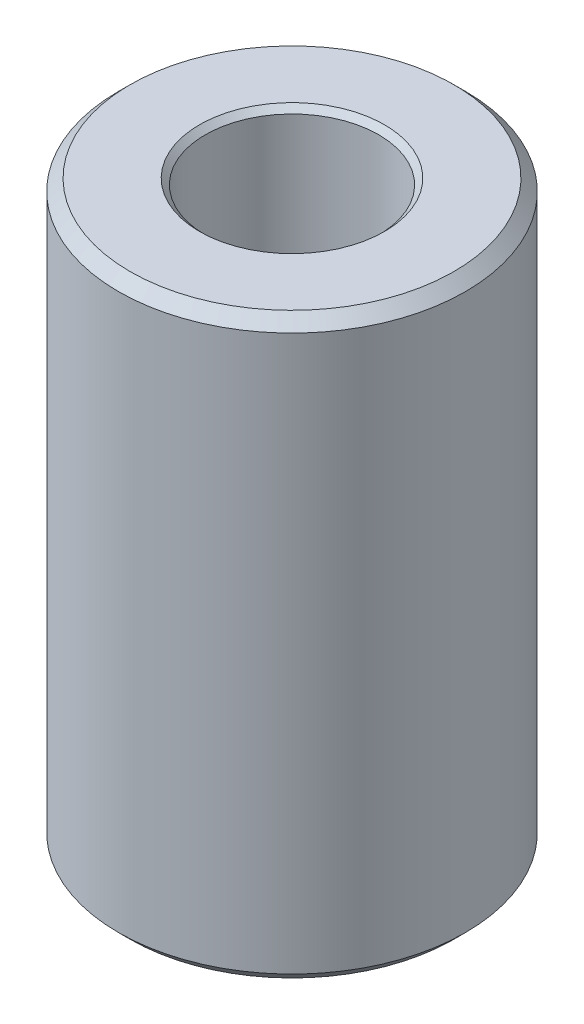
ISO-10303-21;
HEADER;
FILE_DESCRIPTION(('STEP AP214'),'2;1');
FILE_NAME('part.step','',(''),(''),'','','');
FILE_SCHEMA(('AUTOMOTIVE_DESIGN { 1 0 10303 214 1 1 1 1 }'));
ENDSEC;
DATA;
#1=APPLICATION_CONTEXT('core data for automotive mechanical design processes');
#2=APPLICATION_PROTOCOL_DEFINITION('international standard','automotive_design',2000,#1);
#3=PRODUCT_CONTEXT('',#1,'mechanical');
#4=PRODUCT('Part','Part','',(#3));
#5=PRODUCT_RELATED_PRODUCT_CATEGORY('part','',(#4));
#6=PRODUCT_DEFINITION_FORMATION('','',#4);
#7=PRODUCT_DEFINITION_CONTEXT('part definition',#1,'design');
#8=PRODUCT_DEFINITION('design','',#6,#7);
#9=PRODUCT_DEFINITION_SHAPE('','',#8);
#10=(LENGTH_UNIT() NAMED_UNIT(*) SI_UNIT(.MILLI.,.METRE.));
#11=(NAMED_UNIT(*) PLANE_ANGLE_UNIT() SI_UNIT($,.RADIAN.));
#12=(NAMED_UNIT(*) SI_UNIT($,.STERADIAN.) SOLID_ANGLE_UNIT());
#13=UNCERTAINTY_MEASURE_WITH_UNIT(LENGTH_MEASURE(1.E-05),#10,'distance_accuracy_value','');
#14=(GEOMETRIC_REPRESENTATION_CONTEXT(3) GLOBAL_UNCERTAINTY_ASSIGNED_CONTEXT((#13)) GLOBAL_UNIT_ASSIGNED_CONTEXT((#10,
#11,#12)) REPRESENTATION_CONTEXT('',''));
#15=CARTESIAN_POINT('',(0.,0.,0.));
#16=DIRECTION('',(0.,0.,1.));
#17=DIRECTION('',(1.,0.,0.));
#18=AXIS2_PLACEMENT_3D('',#15,#16,#17);
#19=CARTESIAN_POINT('',(0.,10.,0.));
#20=DIRECTION('',(0.,-1.,0.));
#21=DIRECTION('',(0.,0.,-1.));
#22=AXIS2_PLACEMENT_3D('',#19,#20,#21);
#23=CYLINDRICAL_SURFACE('',#22,3.);
#24=CARTESIAN_POINT('',(0.,9.8,0.));
#25=DIRECTION('',(0.,1.,0.));
#26=DIRECTION('',(0.,0.,1.));
#27=AXIS2_PLACEMENT_3D('',#24,#25,#26);
#28=CIRCLE('',#27,3.);
#29=CARTESIAN_POINT('',(0.,9.8,3.));
#30=VERTEX_POINT('',#29);
#31=EDGE_CURVE('E63',#30,#30,#28,.F.);
#32=ORIENTED_EDGE('',*,*,#31,.T.);
#33=EDGE_LOOP('',(#32));
#34=FACE_BOUND('',#33,.T.);
#35=CARTESIAN_POINT('',(0.,0.199999999999997,0.));
#36=DIRECTION('',(0.,1.,0.));
#37=DIRECTION('',(0.,0.,1.));
#38=AXIS2_PLACEMENT_3D('',#35,#36,#37);
#39=CIRCLE('',#38,3.);
#40=CARTESIAN_POINT('',(0.,0.199999999999997,3.));
#41=VERTEX_POINT('',#40);
#42=EDGE_CURVE('E66',#41,#41,#39,.T.);
#43=ORIENTED_EDGE('',*,*,#42,.T.);
#44=EDGE_LOOP('',(#43));
#45=FACE_BOUND('',#44,.T.);
#46=ADVANCED_FACE('F39',(#34,#45),#23,.T.);
#47=CARTESIAN_POINT('',(0.,10.,0.));
#48=DIRECTION('',(0.,1.,0.));
#49=DIRECTION('',(0.,0.,1.));
#50=AXIS2_PLACEMENT_3D('',#47,#48,#49);
#51=PLANE('',#50);
#52=CARTESIAN_POINT('',(0.,10.,0.));
#53=DIRECTION('',(0.,1.,0.));
#54=DIRECTION('',(0.,0.,1.));
#55=AXIS2_PLACEMENT_3D('',#52,#53,#54);
#56=CIRCLE('',#55,1.6);
#57=CARTESIAN_POINT('',(0.,10.,1.6));
#58=VERTEX_POINT('',#57);
#59=EDGE_CURVE('E10',#58,#58,#56,.F.);
#60=ORIENTED_EDGE('',*,*,#59,.T.);
#61=EDGE_LOOP('',(#60));
#62=FACE_BOUND('',#61,.T.);
#63=CARTESIAN_POINT('',(0.,10.,0.));
#64=DIRECTION('',(0.,1.,0.));
#65=DIRECTION('',(0.,0.,1.));
#66=AXIS2_PLACEMENT_3D('',#63,#64,#65);
#67=CIRCLE('',#66,2.8);
#68=CARTESIAN_POINT('',(0.,10.,2.8));
#69=VERTEX_POINT('',#68);
#70=EDGE_CURVE('E69',#69,#69,#67,.T.);
#71=ORIENTED_EDGE('',*,*,#70,.T.);
#72=EDGE_LOOP('',(#71));
#73=FACE_BOUND('',#72,.T.);
#74=ADVANCED_FACE('F97',(#62,#73),#51,.T.);
#75=CARTESIAN_POINT('',(0.,0.,0.));
#76=DIRECTION('',(0.,1.,0.));
#77=DIRECTION('',(0.,0.,1.));
#78=AXIS2_PLACEMENT_3D('',#75,#76,#77);
#79=PLANE('',#78);
#80=CARTESIAN_POINT('',(0.,0.,0.));
#81=DIRECTION('',(0.,1.,0.));
#82=DIRECTION('',(0.,0.,1.));
#83=AXIS2_PLACEMENT_3D('',#80,#81,#82);
#84=CIRCLE('',#83,1.1);
#85=CARTESIAN_POINT('',(0.,0.,1.1));
#86=VERTEX_POINT('',#85);
#87=EDGE_CURVE('E55',#86,#86,#84,.T.);
#88=ORIENTED_EDGE('',*,*,#87,.T.);
#89=EDGE_LOOP('',(#88));
#90=FACE_BOUND('',#89,.T.);
#91=CARTESIAN_POINT('',(0.,0.,0.));
#92=DIRECTION('',(0.,1.,0.));
#93=DIRECTION('',(0.,0.,1.));
#94=AXIS2_PLACEMENT_3D('',#91,#92,#93);
#95=CIRCLE('',#94,2.8);
#96=CARTESIAN_POINT('',(0.,0.,2.8));
#97=VERTEX_POINT('',#96);
#98=EDGE_CURVE('E60',#97,#97,#95,.F.);
#99=ORIENTED_EDGE('',*,*,#98,.T.);
#100=EDGE_LOOP('',(#99));
#101=FACE_BOUND('',#100,.T.);
#102=ADVANCED_FACE('F93',(#90,#101),#79,.F.);
#103=CARTESIAN_POINT('',(0.,5.,0.));
#104=DIRECTION('',(0.,-1.,0.));
#105=DIRECTION('',(0.,0.,-1.));
#106=AXIS2_PLACEMENT_3D('',#103,#104,#105);
#107=CYLINDRICAL_SURFACE('',#106,1.);
#108=CARTESIAN_POINT('',(0.,0.1,0.));
#109=DIRECTION('',(0.,1.,0.));
#110=DIRECTION('',(0.,0.,1.));
#111=AXIS2_PLACEMENT_3D('',#108,#109,#110);
#112=CIRCLE('',#111,1.);
#113=CARTESIAN_POINT('',(0.,0.1,1.));
#114=VERTEX_POINT('',#113);
#115=EDGE_CURVE('E51',#114,#114,#112,.F.);
#116=ORIENTED_EDGE('',*,*,#115,.T.);
#117=EDGE_LOOP('',(#116));
#118=FACE_BOUND('',#117,.T.);
#119=CARTESIAN_POINT('',(0.,5.,0.));
#120=DIRECTION('',(0.,1.,0.));
#121=DIRECTION('',(0.,0.,1.));
#122=AXIS2_PLACEMENT_3D('',#119,#120,#121);
#123=CIRCLE('',#122,1.);
#124=CARTESIAN_POINT('',(0.,5.,1.));
#125=VERTEX_POINT('',#124);
#126=EDGE_CURVE('E72',#125,#125,#123,.T.);
#127=ORIENTED_EDGE('',*,*,#126,.T.);
#128=EDGE_LOOP('',(#127));
#129=FACE_BOUND('',#128,.T.);
#130=ADVANCED_FACE('F83',(#118,#129),#107,.F.);
#131=CARTESIAN_POINT('',(0.,5.,0.));
#132=DIRECTION('',(0.,1.,0.));
#133=DIRECTION('',(0.,0.,1.));
#134=AXIS2_PLACEMENT_3D('',#131,#132,#133);
#135=CYLINDRICAL_SURFACE('',#134,1.5);
#136=CARTESIAN_POINT('',(0.,9.9,0.));
#137=DIRECTION('',(0.,1.,0.));
#138=DIRECTION('',(0.,0.,1.));
#139=AXIS2_PLACEMENT_3D('',#136,#137,#138);
#140=CIRCLE('',#139,1.5);
#141=CARTESIAN_POINT('',(0.,9.9,1.5));
#142=VERTEX_POINT('',#141);
#143=EDGE_CURVE('E47',#142,#142,#140,.T.);
#144=ORIENTED_EDGE('',*,*,#143,.T.);
#145=EDGE_LOOP('',(#144));
#146=FACE_BOUND('',#145,.T.);
#147=CARTESIAN_POINT('',(0.,5.,0.));
#148=DIRECTION('',(0.,1.,0.));
#149=DIRECTION('',(0.,0.,1.));
#150=AXIS2_PLACEMENT_3D('',#147,#148,#149);
#151=CIRCLE('',#150,1.5);
#152=CARTESIAN_POINT('',(0.,5.,1.5));
#153=VERTEX_POINT('',#152);
#154=EDGE_CURVE('E75',#153,#153,#151,.T.);
#155=ORIENTED_EDGE('',*,*,#154,.F.);
#156=EDGE_LOOP('',(#155));
#157=FACE_BOUND('',#156,.T.);
#158=ADVANCED_FACE('F81',(#146,#157),#135,.F.);
#159=CARTESIAN_POINT('',(0.,5.,0.));
#160=DIRECTION('',(0.,1.,0.));
#161=DIRECTION('',(0.,0.,1.));
#162=AXIS2_PLACEMENT_3D('',#159,#160,#161);
#163=PLANE('',#162);
#164=ORIENTED_EDGE('',*,*,#126,.F.);
#165=EDGE_LOOP('',(#164));
#166=FACE_BOUND('',#165,.T.);
#167=ORIENTED_EDGE('',*,*,#154,.T.);
#168=EDGE_LOOP('',(#167));
#169=FACE_BOUND('',#168,.T.);
#170=ADVANCED_FACE('F79',(#166,#169),#163,.T.);
#171=CARTESIAN_POINT('',(0.,10.,0.));
#172=DIRECTION('',(0.,-1.,0.));
#173=DIRECTION('',(0.,0.,-1.));
#174=AXIS2_PLACEMENT_3D('',#171,#172,#173);
#175=CONICAL_SURFACE('',#174,2.8,0.785398163397444);
#176=ORIENTED_EDGE('',*,*,#31,.F.);
#177=EDGE_LOOP('',(#176));
#178=FACE_BOUND('',#177,.T.);
#179=ORIENTED_EDGE('',*,*,#70,.F.);
#180=EDGE_LOOP('',(#179));
#181=FACE_BOUND('',#180,.T.);
#182=ADVANCED_FACE('F90',(#178,#181),#175,.T.);
#183=CARTESIAN_POINT('',(0.,0.199999999999997,0.));
#184=DIRECTION('',(0.,1.,0.));
#185=DIRECTION('',(0.,0.,1.));
#186=AXIS2_PLACEMENT_3D('',#183,#184,#185);
#187=CONICAL_SURFACE('',#186,3.,0.785398163397448);
#188=ORIENTED_EDGE('',*,*,#98,.F.);
#189=EDGE_LOOP('',(#188));
#190=FACE_BOUND('',#189,.T.);
#191=ORIENTED_EDGE('',*,*,#42,.F.);
#192=EDGE_LOOP('',(#191));
#193=FACE_BOUND('',#192,.T.);
#194=ADVANCED_FACE('F113',(#190,#193),#187,.T.);
#195=CARTESIAN_POINT('',(0.,0.,0.));
#196=DIRECTION('',(0.,-1.,0.));
#197=DIRECTION('',(0.,0.,-1.));
#198=AXIS2_PLACEMENT_3D('',#195,#196,#197);
#199=CONICAL_SURFACE('',#198,1.1,0.785398163397448);
#200=ORIENTED_EDGE('',*,*,#115,.F.);
#201=EDGE_LOOP('',(#200));
#202=FACE_BOUND('',#201,.T.);
#203=ORIENTED_EDGE('',*,*,#87,.F.);
#204=EDGE_LOOP('',(#203));
#205=FACE_BOUND('',#204,.T.);
#206=ADVANCED_FACE('F119',(#202,#205),#199,.F.);
#207=CARTESIAN_POINT('',(0.,9.9,0.));
#208=DIRECTION('',(0.,1.,0.));
#209=DIRECTION('',(0.,0.,1.));
#210=AXIS2_PLACEMENT_3D('',#207,#208,#209);
#211=CONICAL_SURFACE('',#210,1.5,0.785398163397436);
#212=ORIENTED_EDGE('',*,*,#59,.F.);
#213=EDGE_LOOP('',(#212));
#214=FACE_BOUND('',#213,.T.);
#215=ORIENTED_EDGE('',*,*,#143,.F.);
#216=EDGE_LOOP('',(#215));
#217=FACE_BOUND('',#216,.T.);
#218=ADVANCED_FACE('F42',(#214,#217),#211,.F.);
#219=CLOSED_SHELL('',(#46,#74,#102,#130,#158,#170,#182,#194,#206,#218));
#220=MANIFOLD_SOLID_BREP('B2',#219);
#221=ADVANCED_BREP_SHAPE_REPRESENTATION('',(#18,#220),#14);
#222=SHAPE_DEFINITION_REPRESENTATION(#9,#221);
ENDSEC;
END-ISO-10303-21;
